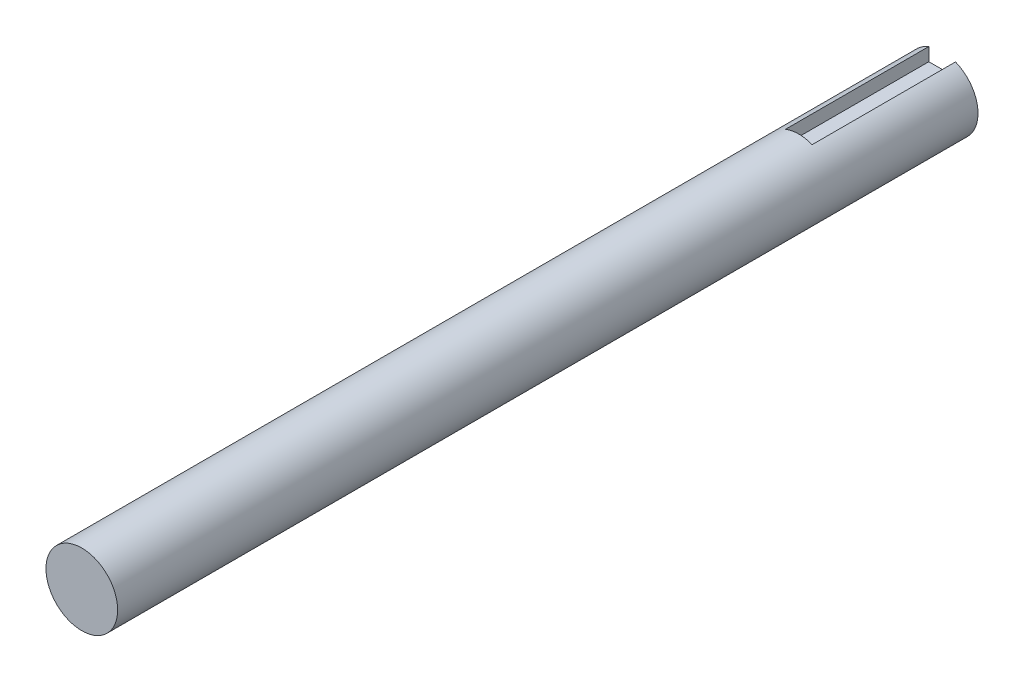
ISO-10303-21;
HEADER;
FILE_DESCRIPTION(('STEP AP214'),'2;1');
FILE_NAME('part.step','',(''),(''),'','','');
FILE_SCHEMA(('AUTOMOTIVE_DESIGN { 1 0 10303 214 1 1 1 1 }'));
ENDSEC;
DATA;
#1=APPLICATION_CONTEXT('core data for automotive mechanical design processes');
#2=APPLICATION_PROTOCOL_DEFINITION('international standard','automotive_design',2000,#1);
#3=PRODUCT_CONTEXT('',#1,'mechanical');
#4=PRODUCT('Part','Part','',(#3));
#5=PRODUCT_RELATED_PRODUCT_CATEGORY('part','',(#4));
#6=PRODUCT_DEFINITION_FORMATION('','',#4);
#7=PRODUCT_DEFINITION_CONTEXT('part definition',#1,'design');
#8=PRODUCT_DEFINITION('design','',#6,#7);
#9=PRODUCT_DEFINITION_SHAPE('','',#8);
#10=(LENGTH_UNIT() NAMED_UNIT(*) SI_UNIT(.MILLI.,.METRE.));
#11=(NAMED_UNIT(*) PLANE_ANGLE_UNIT() SI_UNIT($,.RADIAN.));
#12=(NAMED_UNIT(*) SI_UNIT($,.STERADIAN.) SOLID_ANGLE_UNIT());
#13=UNCERTAINTY_MEASURE_WITH_UNIT(LENGTH_MEASURE(1.E-05),#10,'distance_accuracy_value','');
#14=(GEOMETRIC_REPRESENTATION_CONTEXT(3) GLOBAL_UNCERTAINTY_ASSIGNED_CONTEXT((#13)) GLOBAL_UNIT_ASSIGNED_CONTEXT((#10,
#11,#12)) REPRESENTATION_CONTEXT('',''));
#15=CARTESIAN_POINT('',(0.,0.,0.));
#16=DIRECTION('',(0.,0.,1.));
#17=DIRECTION('',(1.,0.,0.));
#18=AXIS2_PLACEMENT_3D('',#15,#16,#17);
#19=CARTESIAN_POINT('',(0.,0.,38.1));
#20=DIRECTION('',(0.,0.,-1.));
#21=DIRECTION('',(-1.,0.,0.));
#22=AXIS2_PLACEMENT_3D('',#19,#20,#21);
#23=CYLINDRICAL_SURFACE('',#22,3.175);
#24=CARTESIAN_POINT('',(0.,0.,38.1));
#25=DIRECTION('',(0.,0.,1.));
#26=DIRECTION('',(1.,0.,0.));
#27=AXIS2_PLACEMENT_3D('',#24,#25,#26);
#28=CIRCLE('',#27,3.175);
#29=CARTESIAN_POINT('',(3.175,0.,38.1));
#30=VERTEX_POINT('',#29);
#31=EDGE_CURVE('E11',#30,#30,#28,.T.);
#32=ORIENTED_EDGE('',*,*,#31,.F.);
#33=EDGE_LOOP('',(#32));
#34=FACE_BOUND('',#33,.T.);
#35=CARTESIAN_POINT('',(0.,0.,-25.4));
#36=DIRECTION('',(0.,0.,-1.));
#37=DIRECTION('',(-1.,0.,0.));
#38=AXIS2_PLACEMENT_3D('',#35,#36,#37);
#39=CIRCLE('',#38,3.175);
#40=CARTESIAN_POINT('',(-1.1811,2.94713891596579,-25.4));
#41=VERTEX_POINT('',#40);
#42=CARTESIAN_POINT('',(1.1811,2.94713891596579,-25.4));
#43=VERTEX_POINT('',#42);
#44=EDGE_CURVE('E97',#41,#43,#39,.T.);
#45=ORIENTED_EDGE('',*,*,#44,.F.);
#46=DIRECTION('',(0.,0.,-1.));
#47=VECTOR('',#46,1.);
#48=CARTESIAN_POINT('',(-1.1811,2.94713891596579,-25.4));
#49=LINE('',#48,#47);
#50=CARTESIAN_POINT('',(-1.1811,2.94713891596579,-38.1));
#51=VERTEX_POINT('',#50);
#52=EDGE_CURVE('E59',#41,#51,#49,.T.);
#53=ORIENTED_EDGE('',*,*,#52,.T.);
#54=CARTESIAN_POINT('',(0.,0.,-38.1));
#55=DIRECTION('',(0.,0.,1.));
#56=DIRECTION('',(1.,0.,0.));
#57=AXIS2_PLACEMENT_3D('',#54,#55,#56);
#58=CIRCLE('',#57,3.175);
#59=CARTESIAN_POINT('',(1.1811,2.94713891596579,-38.1));
#60=VERTEX_POINT('',#59);
#61=EDGE_CURVE('E43',#51,#60,#58,.T.);
#62=ORIENTED_EDGE('',*,*,#61,.T.);
#63=DIRECTION('',(0.,0.,-1.));
#64=VECTOR('',#63,1.);
#65=CARTESIAN_POINT('',(1.1811,2.94713891596579,-25.4));
#66=LINE('',#65,#64);
#67=EDGE_CURVE('E50',#43,#60,#66,.T.);
#68=ORIENTED_EDGE('',*,*,#67,.F.);
#69=EDGE_LOOP('',(#45,#53,#62,#68));
#70=FACE_BOUND('',#69,.T.);
#71=ADVANCED_FACE('F36',(#34,#70),#23,.T.);
#72=CARTESIAN_POINT('',(0.,0.,38.1));
#73=DIRECTION('',(0.,0.,1.));
#74=DIRECTION('',(1.,0.,0.));
#75=AXIS2_PLACEMENT_3D('',#72,#73,#74);
#76=PLANE('',#75);
#77=ORIENTED_EDGE('',*,*,#31,.T.);
#78=EDGE_LOOP('',(#77));
#79=FACE_BOUND('',#78,.T.);
#80=ADVANCED_FACE('F115',(#79),#76,.T.);
#81=CARTESIAN_POINT('',(0.,0.,-38.1));
#82=DIRECTION('',(0.,0.,1.));
#83=DIRECTION('',(1.,0.,0.));
#84=AXIS2_PLACEMENT_3D('',#81,#82,#83);
#85=PLANE('',#84);
#86=ORIENTED_EDGE('',*,*,#61,.F.);
#87=DIRECTION('',(0.,1.,0.));
#88=VECTOR('',#87,1.);
#89=CARTESIAN_POINT('',(-1.1811,2.94713891596579,-38.1));
#90=LINE('',#89,#88);
#91=CARTESIAN_POINT('',(-1.1811,1.77873891596579,-38.1));
#92=VERTEX_POINT('',#91);
#93=EDGE_CURVE('E74',#92,#51,#90,.T.);
#94=ORIENTED_EDGE('',*,*,#93,.F.);
#95=DIRECTION('',(-1.,0.,0.));
#96=VECTOR('',#95,1.);
#97=CARTESIAN_POINT('',(-1.1811,1.77873891596579,-38.1));
#98=LINE('',#97,#96);
#99=CARTESIAN_POINT('',(1.1811,1.77873891596579,-38.1));
#100=VERTEX_POINT('',#99);
#101=EDGE_CURVE('E103',#100,#92,#98,.T.);
#102=ORIENTED_EDGE('',*,*,#101,.F.);
#103=DIRECTION('',(0.,-1.,0.));
#104=VECTOR('',#103,1.);
#105=CARTESIAN_POINT('',(1.1811,1.77873891596579,-38.1));
#106=LINE('',#105,#104);
#107=EDGE_CURVE('E83',#60,#100,#106,.T.);
#108=ORIENTED_EDGE('',*,*,#107,.F.);
#109=EDGE_LOOP('',(#86,#94,#102,#108));
#110=FACE_BOUND('',#109,.T.);
#111=ADVANCED_FACE('F112',(#110),#85,.F.);
#112=CARTESIAN_POINT('',(-1.1811,2.94713891596579,-25.4));
#113=DIRECTION('',(-1.,0.,0.));
#114=DIRECTION('',(0.,0.,1.));
#115=AXIS2_PLACEMENT_3D('',#112,#113,#114);
#116=PLANE('',#115);
#117=ORIENTED_EDGE('',*,*,#93,.T.);
#118=ORIENTED_EDGE('',*,*,#52,.F.);
#119=DIRECTION('',(0.,1.,0.));
#120=VECTOR('',#119,1.);
#121=CARTESIAN_POINT('',(-1.1811,2.94713891596579,-25.4));
#122=LINE('',#121,#120);
#123=CARTESIAN_POINT('',(-1.1811,1.77873891596579,-25.4));
#124=VERTEX_POINT('',#123);
#125=EDGE_CURVE('E93',#124,#41,#122,.T.);
#126=ORIENTED_EDGE('',*,*,#125,.F.);
#127=DIRECTION('',(0.,0.,-1.));
#128=VECTOR('',#127,1.);
#129=CARTESIAN_POINT('',(-1.1811,1.77873891596579,-25.4));
#130=LINE('',#129,#128);
#131=EDGE_CURVE('E87',#124,#92,#130,.T.);
#132=ORIENTED_EDGE('',*,*,#131,.T.);
#133=EDGE_LOOP('',(#117,#118,#126,#132));
#134=FACE_BOUND('',#133,.T.);
#135=ADVANCED_FACE('F114',(#134),#116,.F.);
#136=CARTESIAN_POINT('',(-1.1811,1.77873891596579,-25.4));
#137=DIRECTION('',(0.,-1.,0.));
#138=DIRECTION('',(0.,0.,-1.));
#139=AXIS2_PLACEMENT_3D('',#136,#137,#138);
#140=PLANE('',#139);
#141=ORIENTED_EDGE('',*,*,#101,.T.);
#142=ORIENTED_EDGE('',*,*,#131,.F.);
#143=DIRECTION('',(-1.,0.,0.));
#144=VECTOR('',#143,1.);
#145=CARTESIAN_POINT('',(-1.1811,1.77873891596579,-25.4));
#146=LINE('',#145,#144);
#147=CARTESIAN_POINT('',(1.1811,1.77873891596579,-25.4));
#148=VERTEX_POINT('',#147);
#149=EDGE_CURVE('E90',#148,#124,#146,.T.);
#150=ORIENTED_EDGE('',*,*,#149,.F.);
#151=DIRECTION('',(0.,0.,-1.));
#152=VECTOR('',#151,1.);
#153=CARTESIAN_POINT('',(1.1811,1.77873891596579,-25.4));
#154=LINE('',#153,#152);
#155=EDGE_CURVE('E80',#148,#100,#154,.T.);
#156=ORIENTED_EDGE('',*,*,#155,.T.);
#157=EDGE_LOOP('',(#141,#142,#150,#156));
#158=FACE_BOUND('',#157,.T.);
#159=ADVANCED_FACE('F91',(#158),#140,.F.);
#160=CARTESIAN_POINT('',(1.1811,1.77873891596579,-25.4));
#161=DIRECTION('',(1.,0.,0.));
#162=DIRECTION('',(0.,0.,-1.));
#163=AXIS2_PLACEMENT_3D('',#160,#161,#162);
#164=PLANE('',#163);
#165=ORIENTED_EDGE('',*,*,#107,.T.);
#166=ORIENTED_EDGE('',*,*,#155,.F.);
#167=DIRECTION('',(0.,-1.,0.));
#168=VECTOR('',#167,1.);
#169=CARTESIAN_POINT('',(1.1811,1.77873891596579,-25.4));
#170=LINE('',#169,#168);
#171=EDGE_CURVE('E78',#43,#148,#170,.T.);
#172=ORIENTED_EDGE('',*,*,#171,.F.);
#173=ORIENTED_EDGE('',*,*,#67,.T.);
#174=EDGE_LOOP('',(#165,#166,#172,#173));
#175=FACE_BOUND('',#174,.T.);
#176=ADVANCED_FACE('F82',(#175),#164,.F.);
#177=CARTESIAN_POINT('',(0.,0.,-25.4));
#178=DIRECTION('',(0.,0.,-1.));
#179=DIRECTION('',(-1.,0.,0.));
#180=AXIS2_PLACEMENT_3D('',#177,#178,#179);
#181=PLANE('',#180);
#182=ORIENTED_EDGE('',*,*,#44,.T.);
#183=ORIENTED_EDGE('',*,*,#171,.T.);
#184=ORIENTED_EDGE('',*,*,#149,.T.);
#185=ORIENTED_EDGE('',*,*,#125,.T.);
#186=EDGE_LOOP('',(#182,#183,#184,#185));
#187=FACE_BOUND('',#186,.T.);
#188=ADVANCED_FACE('F95',(#187),#181,.T.);
#189=CLOSED_SHELL('',(#71,#80,#111,#135,#159,#176,#188));
#190=MANIFOLD_SOLID_BREP('B2',#189);
#191=ADVANCED_BREP_SHAPE_REPRESENTATION('',(#18,#190),#14);
#192=SHAPE_DEFINITION_REPRESENTATION(#9,#191);
ENDSEC;
END-ISO-10303-21;
